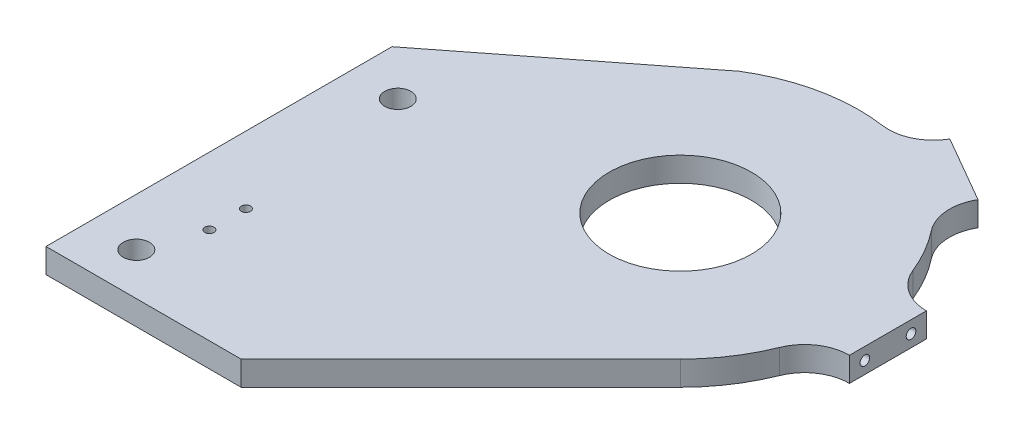
ISO-10303-21;
HEADER;
FILE_DESCRIPTION(('STEP AP214'),'2;1');
FILE_NAME('part.step','',(''),(''),'','','');
FILE_SCHEMA(('AUTOMOTIVE_DESIGN { 1 0 10303 214 1 1 1 1 }'));
ENDSEC;
DATA;
#1=APPLICATION_CONTEXT('core data for automotive mechanical design processes');
#2=APPLICATION_PROTOCOL_DEFINITION('international standard','automotive_design',2000,#1);
#3=PRODUCT_CONTEXT('',#1,'mechanical');
#4=PRODUCT('Part','Part','',(#3));
#5=PRODUCT_RELATED_PRODUCT_CATEGORY('part','',(#4));
#6=PRODUCT_DEFINITION_FORMATION('','',#4);
#7=PRODUCT_DEFINITION_CONTEXT('part definition',#1,'design');
#8=PRODUCT_DEFINITION('design','',#6,#7);
#9=PRODUCT_DEFINITION_SHAPE('','',#8);
#10=(LENGTH_UNIT() NAMED_UNIT(*) SI_UNIT(.MILLI.,.METRE.));
#11=(NAMED_UNIT(*) PLANE_ANGLE_UNIT() SI_UNIT($,.RADIAN.));
#12=(NAMED_UNIT(*) SI_UNIT($,.STERADIAN.) SOLID_ANGLE_UNIT());
#13=UNCERTAINTY_MEASURE_WITH_UNIT(LENGTH_MEASURE(1.E-05),#10,'distance_accuracy_value','');
#14=(GEOMETRIC_REPRESENTATION_CONTEXT(3) GLOBAL_UNCERTAINTY_ASSIGNED_CONTEXT((#13)) GLOBAL_UNIT_ASSIGNED_CONTEXT((#10,
#11,#12)) REPRESENTATION_CONTEXT('',''));
#15=CARTESIAN_POINT('',(0.,0.,0.));
#16=DIRECTION('',(0.,0.,1.));
#17=DIRECTION('',(1.,0.,0.));
#18=AXIS2_PLACEMENT_3D('',#15,#16,#17);
#19=CARTESIAN_POINT('',(75.,-6.35,-90.));
#20=DIRECTION('',(0.,1.,0.));
#21=DIRECTION('',(0.,0.,1.));
#22=AXIS2_PLACEMENT_3D('',#19,#20,#21);
#23=CYLINDRICAL_SURFACE('',#22,46.5);
#24=CARTESIAN_POINT('',(75.,0.,-90.));
#25=DIRECTION('',(0.,1.,0.));
#26=DIRECTION('',(0.,0.,-1.));
#27=AXIS2_PLACEMENT_3D('',#24,#25,#26);
#28=CIRCLE('',#27,46.5);
#29=CARTESIAN_POINT('',(81.5611958816388,0.,-136.034777164691));
#30=VERTEX_POINT('',#29);
#31=CARTESIAN_POINT('',(50.7609306503488,0.,-129.682710555893));
#32=VERTEX_POINT('',#31);
#33=EDGE_CURVE('E285',#30,#32,#28,.T.);
#34=ORIENTED_EDGE('',*,*,#33,.F.);
#35=DIRECTION('',(0.,-1.,0.));
#36=VECTOR('',#35,1.);
#37=CARTESIAN_POINT('',(81.5611958816388,37.8624128084729,-136.034777164691));
#38=LINE('',#37,#36);
#39=CARTESIAN_POINT('',(81.5611958816388,-6.35,-136.034777164691));
#40=VERTEX_POINT('',#39);
#41=EDGE_CURVE('E60',#30,#40,#38,.T.);
#42=ORIENTED_EDGE('',*,*,#41,.T.);
#43=CARTESIAN_POINT('',(75.,-6.35,-90.));
#44=DIRECTION('',(0.,1.,0.));
#45=DIRECTION('',(0.,0.,-1.));
#46=AXIS2_PLACEMENT_3D('',#43,#44,#45);
#47=CIRCLE('',#46,46.5);
#48=CARTESIAN_POINT('',(50.7609306503488,-6.35,-129.682710555893));
#49=VERTEX_POINT('',#48);
#50=EDGE_CURVE('E269',#40,#49,#47,.T.);
#51=ORIENTED_EDGE('',*,*,#50,.T.);
#52=DIRECTION('',(0.,1.,0.));
#53=VECTOR('',#52,1.);
#54=CARTESIAN_POINT('',(50.7609306503488,-6.35,-129.682710555893));
#55=LINE('',#54,#53);
#56=EDGE_CURVE('E52',#49,#32,#55,.T.);
#57=ORIENTED_EDGE('',*,*,#56,.T.);
#58=EDGE_LOOP('',(#34,#42,#51,#57));
#59=FACE_BOUND('',#58,.T.);
#60=ADVANCED_FACE('F43',(#59),#23,.T.);
#61=DIRECTION('',(0.,-1.,0.));
#62=VECTOR('',#61,1.);
#63=CARTESIAN_POINT('',(111.586688541359,37.8624128084729,-118.699550895051));
#64=LINE('',#63,#62);
#65=CARTESIAN_POINT('',(111.586688541359,0.,-118.699550895051));
#66=VERTEX_POINT('',#65);
#67=CARTESIAN_POINT('',(111.586688541359,-6.35,-118.699550895051));
#68=VERTEX_POINT('',#67);
#69=EDGE_CURVE('E176',#66,#68,#64,.T.);
#70=ORIENTED_EDGE('',*,*,#69,.F.);
#71=CARTESIAN_POINT('',(118.147884422998,0.,-107.33522626964));
#72=VERTEX_POINT('',#71);
#73=EDGE_CURVE('E289',#72,#66,#28,.T.);
#74=ORIENTED_EDGE('',*,*,#73,.F.);
#75=DIRECTION('',(0.,-1.,0.));
#76=VECTOR('',#75,1.);
#77=CARTESIAN_POINT('',(118.147884422998,36.3291713609758,-107.33522626964));
#78=LINE('',#77,#76);
#79=CARTESIAN_POINT('',(118.147884422998,-6.35,-107.33522626964));
#80=VERTEX_POINT('',#79);
#81=EDGE_CURVE('E68',#72,#80,#78,.T.);
#82=ORIENTED_EDGE('',*,*,#81,.T.);
#83=EDGE_CURVE('E274',#80,#68,#47,.T.);
#84=ORIENTED_EDGE('',*,*,#83,.T.);
#85=EDGE_LOOP('',(#70,#74,#82,#84));
#86=FACE_BOUND('',#85,.T.);
#87=ADVANCED_FACE('F337',(#86),#23,.T.);
#88=CARTESIAN_POINT('',(0.,-6.35,0.));
#89=DIRECTION('',(-1.,0.,0.));
#90=DIRECTION('',(0.,0.,1.));
#91=AXIS2_PLACEMENT_3D('',#88,#89,#90);
#92=PLANE('',#91);
#93=DIRECTION('',(0.,0.,1.));
#94=VECTOR('',#93,1.);
#95=CARTESIAN_POINT('',(0.,0.,0.));
#96=LINE('',#95,#94);
#97=CARTESIAN_POINT('',(0.,0.,-90.));
#98=VERTEX_POINT('',#97);
#99=CARTESIAN_POINT('',(0.,0.,0.));
#100=VERTEX_POINT('',#99);
#101=EDGE_CURVE('E250',#98,#100,#96,.T.);
#102=ORIENTED_EDGE('',*,*,#101,.F.);
#103=DIRECTION('',(0.,1.,0.));
#104=VECTOR('',#103,1.);
#105=CARTESIAN_POINT('',(0.,-6.35,-90.));
#106=LINE('',#105,#104);
#107=CARTESIAN_POINT('',(0.,-6.35,-90.));
#108=VERTEX_POINT('',#107);
#109=EDGE_CURVE('E11',#108,#98,#106,.T.);
#110=ORIENTED_EDGE('',*,*,#109,.F.);
#111=DIRECTION('',(0.,0.,1.));
#112=VECTOR('',#111,1.);
#113=CARTESIAN_POINT('',(0.,-6.35,0.));
#114=LINE('',#113,#112);
#115=CARTESIAN_POINT('',(0.,-6.35,0.));
#116=VERTEX_POINT('',#115);
#117=EDGE_CURVE('E259',#108,#116,#114,.T.);
#118=ORIENTED_EDGE('',*,*,#117,.T.);
#119=DIRECTION('',(0.,1.,0.));
#120=VECTOR('',#119,1.);
#121=CARTESIAN_POINT('',(0.,-6.35,0.));
#122=LINE('',#121,#120);
#123=EDGE_CURVE('E47',#116,#100,#122,.T.);
#124=ORIENTED_EDGE('',*,*,#123,.T.);
#125=EDGE_LOOP('',(#102,#110,#118,#124));
#126=FACE_BOUND('',#125,.T.);
#127=ADVANCED_FACE('F45',(#126),#92,.T.);
#128=CARTESIAN_POINT('',(0.,-6.35,-90.));
#129=DIRECTION('',(-0.615892028317826,0.,-0.787830571540959));
#130=DIRECTION('',(-0.787830571540959,0.,0.615892028317826));
#131=AXIS2_PLACEMENT_3D('',#128,#129,#130);
#132=PLANE('',#131);
#133=DIRECTION('',(-0.787830571540959,0.,0.615892028317826));
#134=VECTOR('',#133,1.);
#135=CARTESIAN_POINT('',(0.,0.,-90.));
#136=LINE('',#135,#134);
#137=EDGE_CURVE('E263',#32,#98,#136,.T.);
#138=ORIENTED_EDGE('',*,*,#137,.F.);
#139=ORIENTED_EDGE('',*,*,#56,.F.);
#140=DIRECTION('',(-0.787830571540959,0.,0.615892028317826));
#141=VECTOR('',#140,1.);
#142=CARTESIAN_POINT('',(0.,-6.35,-90.));
#143=LINE('',#142,#141);
#144=EDGE_CURVE('E273',#49,#108,#143,.T.);
#145=ORIENTED_EDGE('',*,*,#144,.T.);
#146=ORIENTED_EDGE('',*,*,#109,.T.);
#147=EDGE_LOOP('',(#138,#139,#145,#146));
#148=FACE_BOUND('',#147,.T.);
#149=ADVANCED_FACE('F310',(#148),#132,.T.);
#150=DIRECTION('',(0.,-1.,0.));
#151=VECTOR('',#150,1.);
#152=CARTESIAN_POINT('',(118.147884422998,36.3291713609758,-72.6647737303596));
#153=LINE('',#152,#151);
#154=CARTESIAN_POINT('',(118.147884422998,0.,-72.6647737303596));
#155=VERTEX_POINT('',#154);
#156=CARTESIAN_POINT('',(118.147884422998,-6.35,-72.6647737303596));
#157=VERTEX_POINT('',#156);
#158=EDGE_CURVE('E210',#155,#157,#153,.T.);
#159=ORIENTED_EDGE('',*,*,#158,.F.);
#160=CARTESIAN_POINT('',(107.880465325174,0.,-57.1195346748255));
#161=VERTEX_POINT('',#160);
#162=EDGE_CURVE('E286',#161,#155,#28,.T.);
#163=ORIENTED_EDGE('',*,*,#162,.F.);
#164=DIRECTION('',(0.,1.,0.));
#165=VECTOR('',#164,1.);
#166=CARTESIAN_POINT('',(107.880465325174,-6.35,-57.1195346748255));
#167=LINE('',#166,#165);
#168=CARTESIAN_POINT('',(107.880465325174,-6.35,-57.1195346748255));
#169=VERTEX_POINT('',#168);
#170=EDGE_CURVE('E294',#169,#161,#167,.T.);
#171=ORIENTED_EDGE('',*,*,#170,.F.);
#172=EDGE_CURVE('E270',#169,#157,#47,.T.);
#173=ORIENTED_EDGE('',*,*,#172,.T.);
#174=EDGE_LOOP('',(#159,#163,#171,#173));
#175=FACE_BOUND('',#174,.T.);
#176=ADVANCED_FACE('F323',(#175),#23,.T.);
#177=CARTESIAN_POINT('',(107.880465325174,-6.35,-57.1195346748255));
#178=DIRECTION('',(0.707106781186547,0.,0.707106781186548));
#179=DIRECTION('',(0.707106781186548,0.,-0.707106781186547));
#180=AXIS2_PLACEMENT_3D('',#177,#178,#179);
#181=PLANE('',#180);
#182=DIRECTION('',(0.707106781186548,0.,-0.707106781186547));
#183=VECTOR('',#182,1.);
#184=CARTESIAN_POINT('',(107.880465325174,0.,-57.1195346748255));
#185=LINE('',#184,#183);
#186=CARTESIAN_POINT('',(50.7609306503488,0.,0.));
#187=VERTEX_POINT('',#186);
#188=EDGE_CURVE('E282',#187,#161,#185,.T.);
#189=ORIENTED_EDGE('',*,*,#188,.F.);
#190=DIRECTION('',(0.,1.,0.));
#191=VECTOR('',#190,1.);
#192=CARTESIAN_POINT('',(50.7609306503488,-6.35,0.));
#193=LINE('',#192,#191);
#194=CARTESIAN_POINT('',(50.7609306503488,-6.35,0.));
#195=VERTEX_POINT('',#194);
#196=EDGE_CURVE('E295',#195,#187,#193,.T.);
#197=ORIENTED_EDGE('',*,*,#196,.F.);
#198=DIRECTION('',(0.707106781186548,0.,-0.707106781186547));
#199=VECTOR('',#198,1.);
#200=CARTESIAN_POINT('',(107.880465325174,-6.35,-57.1195346748255));
#201=LINE('',#200,#199);
#202=EDGE_CURVE('E266',#195,#169,#201,.T.);
#203=ORIENTED_EDGE('',*,*,#202,.T.);
#204=ORIENTED_EDGE('',*,*,#170,.T.);
#205=EDGE_LOOP('',(#189,#197,#203,#204));
#206=FACE_BOUND('',#205,.T.);
#207=ADVANCED_FACE('F318',(#206),#181,.T.);
#208=CARTESIAN_POINT('',(0.,-6.35,0.));
#209=DIRECTION('',(0.,0.,1.));
#210=DIRECTION('',(1.,0.,0.));
#211=AXIS2_PLACEMENT_3D('',#208,#209,#210);
#212=PLANE('',#211);
#213=DIRECTION('',(1.,0.,0.));
#214=VECTOR('',#213,1.);
#215=CARTESIAN_POINT('',(0.,0.,0.));
#216=LINE('',#215,#214);
#217=EDGE_CURVE('E279',#100,#187,#216,.T.);
#218=ORIENTED_EDGE('',*,*,#217,.F.);
#219=ORIENTED_EDGE('',*,*,#123,.F.);
#220=DIRECTION('',(1.,0.,0.));
#221=VECTOR('',#220,1.);
#222=CARTESIAN_POINT('',(0.,-6.35,0.));
#223=LINE('',#222,#221);
#224=EDGE_CURVE('E262',#116,#195,#223,.T.);
#225=ORIENTED_EDGE('',*,*,#224,.T.);
#226=ORIENTED_EDGE('',*,*,#196,.T.);
#227=EDGE_LOOP('',(#218,#219,#225,#226));
#228=FACE_BOUND('',#227,.T.);
#229=ADVANCED_FACE('F303',(#228),#212,.T.);
#230=CARTESIAN_POINT('',(75.,-6.35,-90.));
#231=DIRECTION('',(0.,-1.,0.));
#232=DIRECTION('',(0.,0.,-1.));
#233=AXIS2_PLACEMENT_3D('',#230,#231,#232);
#234=PLANE('',#233);
#235=CARTESIAN_POINT('',(17.5,-6.35,-25.));
#236=DIRECTION('',(0.,1.,0.));
#237=DIRECTION('',(0.,0.,1.));
#238=AXIS2_PLACEMENT_3D('',#235,#236,#237);
#239=CIRCLE('',#238,1.2);
#240=CARTESIAN_POINT('',(17.5,-6.35,-23.8));
#241=VERTEX_POINT('',#240);
#242=EDGE_CURVE('E229',#241,#241,#239,.T.);
#243=ORIENTED_EDGE('',*,*,#242,.T.);
#244=EDGE_LOOP('',(#243));
#245=FACE_BOUND('',#244,.T.);
#246=CARTESIAN_POINT('',(17.5,-6.35,-34.5));
#247=DIRECTION('',(0.,1.,0.));
#248=DIRECTION('',(0.,0.,1.));
#249=AXIS2_PLACEMENT_3D('',#246,#247,#248);
#250=CIRCLE('',#249,1.2);
#251=CARTESIAN_POINT('',(17.5,-6.35,-33.3));
#252=VERTEX_POINT('',#251);
#253=EDGE_CURVE('E228',#252,#252,#250,.T.);
#254=ORIENTED_EDGE('',*,*,#253,.T.);
#255=EDGE_LOOP('',(#254));
#256=FACE_BOUND('',#255,.T.);
#257=CARTESIAN_POINT('',(75.,-6.35,-90.));
#258=DIRECTION('',(0.,1.,0.));
#259=DIRECTION('',(0.,0.,1.));
#260=AXIS2_PLACEMENT_3D('',#257,#258,#259);
#261=CIRCLE('',#260,18.5);
#262=CARTESIAN_POINT('',(75.,-6.35,-71.5));
#263=VERTEX_POINT('',#262);
#264=EDGE_CURVE('E241',#263,#263,#261,.T.);
#265=ORIENTED_EDGE('',*,*,#264,.T.);
#266=EDGE_LOOP('',(#265));
#267=FACE_BOUND('',#266,.T.);
#268=CARTESIAN_POINT('',(12.5,-6.35,-79.));
#269=DIRECTION('',(0.,1.,0.));
#270=DIRECTION('',(0.,0.,1.));
#271=AXIS2_PLACEMENT_3D('',#268,#269,#270);
#272=CIRCLE('',#271,3.4);
#273=CARTESIAN_POINT('',(12.5,-6.35,-75.6));
#274=VERTEX_POINT('',#273);
#275=EDGE_CURVE('E247',#274,#274,#272,.T.);
#276=ORIENTED_EDGE('',*,*,#275,.T.);
#277=EDGE_LOOP('',(#276));
#278=FACE_BOUND('',#277,.T.);
#279=CARTESIAN_POINT('',(12.5,-6.35,-11.));
#280=DIRECTION('',(0.,1.,0.));
#281=DIRECTION('',(0.,0.,-1.));
#282=AXIS2_PLACEMENT_3D('',#279,#280,#281);
#283=CIRCLE('',#282,3.4);
#284=CARTESIAN_POINT('',(12.5,-6.35,-14.4));
#285=VERTEX_POINT('',#284);
#286=EDGE_CURVE('E244',#285,#285,#283,.T.);
#287=ORIENTED_EDGE('',*,*,#286,.T.);
#288=EDGE_LOOP('',(#287));
#289=FACE_BOUND('',#288,.T.);
#290=ORIENTED_EDGE('',*,*,#117,.F.);
#291=ORIENTED_EDGE('',*,*,#144,.F.);
#292=ORIENTED_EDGE('',*,*,#50,.F.);
#293=CARTESIAN_POINT('',(83.211400914471,-6.35,-147.612974544086));
#294=DIRECTION('',(0.,1.,0.));
#295=DIRECTION('',(-0.86602540378444,0.,-0.499999999999998));
#296=AXIS2_PLACEMENT_3D('',#293,#294,#295);
#297=CIRCLE('',#296,11.695205479452);
#298=CARTESIAN_POINT('',(93.3397459621554,-6.35,-141.76537180436));
#299=VERTEX_POINT('',#298);
#300=EDGE_CURVE('E172',#40,#299,#297,.T.);
#301=ORIENTED_EDGE('',*,*,#300,.T.);
#302=DIRECTION('',(0.86602540378444,0.,0.499999999999998));
#303=VECTOR('',#302,1.);
#304=CARTESIAN_POINT('',(93.3397459621554,-6.35,-141.76537180436));
#305=LINE('',#304,#303);
#306=CARTESIAN_POINT('',(110.660254037844,-6.35,-131.76537180436));
#307=VERTEX_POINT('',#306);
#308=EDGE_CURVE('E181',#299,#307,#305,.T.);
#309=ORIENTED_EDGE('',*,*,#308,.T.);
#310=CARTESIAN_POINT('',(120.788599085529,-6.35,-125.917769064634));
#311=DIRECTION('',(0.,1.,0.));
#312=DIRECTION('',(0.86602540378444,0.,0.499999999999998));
#313=AXIS2_PLACEMENT_3D('',#310,#311,#312);
#314=CIRCLE('',#313,11.695205479452);
#315=EDGE_CURVE('E184',#307,#68,#314,.T.);
#316=ORIENTED_EDGE('',*,*,#315,.T.);
#317=ORIENTED_EDGE('',*,*,#83,.F.);
#318=CARTESIAN_POINT('',(129.,-6.35,-111.695205479452));
#319=DIRECTION('',(0.,1.,0.));
#320=DIRECTION('',(0.,0.,-1.));
#321=AXIS2_PLACEMENT_3D('',#318,#319,#320);
#322=CIRCLE('',#321,11.695205479452);
#323=CARTESIAN_POINT('',(129.,-6.35,-100.));
#324=VERTEX_POINT('',#323);
#325=EDGE_CURVE('E206',#80,#324,#322,.T.);
#326=ORIENTED_EDGE('',*,*,#325,.T.);
#327=DIRECTION('',(0.,0.,1.));
#328=VECTOR('',#327,1.);
#329=CARTESIAN_POINT('',(129.,-6.35,-100.));
#330=LINE('',#329,#328);
#331=CARTESIAN_POINT('',(129.,-6.35,-80.));
#332=VERTEX_POINT('',#331);
#333=EDGE_CURVE('E215',#324,#332,#330,.T.);
#334=ORIENTED_EDGE('',*,*,#333,.T.);
#335=CARTESIAN_POINT('',(129.,-6.35,-68.304794520548));
#336=DIRECTION('',(0.,1.,0.));
#337=DIRECTION('',(0.,0.,1.));
#338=AXIS2_PLACEMENT_3D('',#335,#336,#337);
#339=CIRCLE('',#338,11.695205479452);
#340=EDGE_CURVE('E218',#332,#157,#339,.T.);
#341=ORIENTED_EDGE('',*,*,#340,.T.);
#342=ORIENTED_EDGE('',*,*,#172,.F.);
#343=ORIENTED_EDGE('',*,*,#202,.F.);
#344=ORIENTED_EDGE('',*,*,#224,.F.);
#345=EDGE_LOOP('',(#290,#291,#292,#301,#309,#316,#317,#326,#334,#341,#342,#343,#344));
#346=FACE_BOUND('',#345,.T.);
#347=ADVANCED_FACE('F313',(#245,#256,#267,#278,#289,#346),#234,.T.);
#348=CARTESIAN_POINT('',(75.,0.,-90.));
#349=DIRECTION('',(0.,-1.,0.));
#350=DIRECTION('',(0.,0.,-1.));
#351=AXIS2_PLACEMENT_3D('',#348,#349,#350);
#352=PLANE('',#351);
#353=CARTESIAN_POINT('',(17.5,0.,-25.));
#354=DIRECTION('',(0.,1.,0.));
#355=DIRECTION('',(0.,0.,1.));
#356=AXIS2_PLACEMENT_3D('',#353,#354,#355);
#357=CIRCLE('',#356,1.2);
#358=CARTESIAN_POINT('',(17.5,0.,-23.8));
#359=VERTEX_POINT('',#358);
#360=EDGE_CURVE('E233',#359,#359,#357,.T.);
#361=ORIENTED_EDGE('',*,*,#360,.F.);
#362=EDGE_LOOP('',(#361));
#363=FACE_BOUND('',#362,.T.);
#364=CARTESIAN_POINT('',(17.5,0.,-34.5));
#365=DIRECTION('',(0.,1.,0.));
#366=DIRECTION('',(0.,0.,1.));
#367=AXIS2_PLACEMENT_3D('',#364,#365,#366);
#368=CIRCLE('',#367,1.2);
#369=CARTESIAN_POINT('',(17.5,0.,-33.3));
#370=VERTEX_POINT('',#369);
#371=EDGE_CURVE('E236',#370,#370,#368,.T.);
#372=ORIENTED_EDGE('',*,*,#371,.F.);
#373=EDGE_LOOP('',(#372));
#374=FACE_BOUND('',#373,.T.);
#375=CARTESIAN_POINT('',(75.,0.,-90.));
#376=DIRECTION('',(0.,1.,0.));
#377=DIRECTION('',(0.,0.,1.));
#378=AXIS2_PLACEMENT_3D('',#375,#376,#377);
#379=CIRCLE('',#378,18.5);
#380=CARTESIAN_POINT('',(75.,0.,-71.5));
#381=VERTEX_POINT('',#380);
#382=EDGE_CURVE('E232',#381,#381,#379,.T.);
#383=ORIENTED_EDGE('',*,*,#382,.F.);
#384=EDGE_LOOP('',(#383));
#385=FACE_BOUND('',#384,.T.);
#386=CARTESIAN_POINT('',(12.5,0.,-79.));
#387=DIRECTION('',(0.,1.,0.));
#388=DIRECTION('',(0.,0.,1.));
#389=AXIS2_PLACEMENT_3D('',#386,#387,#388);
#390=CIRCLE('',#389,3.4);
#391=CARTESIAN_POINT('',(12.5,0.,-75.6));
#392=VERTEX_POINT('',#391);
#393=EDGE_CURVE('E251',#392,#392,#390,.T.);
#394=ORIENTED_EDGE('',*,*,#393,.F.);
#395=EDGE_LOOP('',(#394));
#396=FACE_BOUND('',#395,.T.);
#397=CARTESIAN_POINT('',(12.5,0.,-11.));
#398=DIRECTION('',(0.,1.,0.));
#399=DIRECTION('',(0.,0.,-1.));
#400=AXIS2_PLACEMENT_3D('',#397,#398,#399);
#401=CIRCLE('',#400,3.4);
#402=CARTESIAN_POINT('',(12.5,0.,-14.4));
#403=VERTEX_POINT('',#402);
#404=EDGE_CURVE('E254',#403,#403,#401,.T.);
#405=ORIENTED_EDGE('',*,*,#404,.F.);
#406=EDGE_LOOP('',(#405));
#407=FACE_BOUND('',#406,.T.);
#408=ORIENTED_EDGE('',*,*,#101,.T.);
#409=ORIENTED_EDGE('',*,*,#217,.T.);
#410=ORIENTED_EDGE('',*,*,#188,.T.);
#411=ORIENTED_EDGE('',*,*,#162,.T.);
#412=CARTESIAN_POINT('',(129.,0.,-68.304794520548));
#413=DIRECTION('',(0.,-1.,0.));
#414=DIRECTION('',(0.,0.,-1.));
#415=AXIS2_PLACEMENT_3D('',#412,#413,#414);
#416=CIRCLE('',#415,11.695205479452);
#417=CARTESIAN_POINT('',(129.,0.,-80.));
#418=VERTEX_POINT('',#417);
#419=EDGE_CURVE('E209',#155,#418,#416,.T.);
#420=ORIENTED_EDGE('',*,*,#419,.T.);
#421=DIRECTION('',(0.,0.,-1.));
#422=VECTOR('',#421,1.);
#423=CARTESIAN_POINT('',(129.,0.,-100.));
#424=LINE('',#423,#422);
#425=CARTESIAN_POINT('',(129.,0.,-100.));
#426=VERTEX_POINT('',#425);
#427=EDGE_CURVE('E207',#418,#426,#424,.T.);
#428=ORIENTED_EDGE('',*,*,#427,.T.);
#429=CARTESIAN_POINT('',(129.,0.,-111.695205479452));
#430=DIRECTION('',(0.,-1.,0.));
#431=DIRECTION('',(0.,0.,-1.));
#432=AXIS2_PLACEMENT_3D('',#429,#430,#431);
#433=CIRCLE('',#432,11.695205479452);
#434=EDGE_CURVE('E212',#426,#72,#433,.T.);
#435=ORIENTED_EDGE('',*,*,#434,.T.);
#436=ORIENTED_EDGE('',*,*,#73,.T.);
#437=CARTESIAN_POINT('',(120.788599085529,0.,-125.917769064634));
#438=DIRECTION('',(0.,-1.,0.));
#439=DIRECTION('',(0.,0.,-1.));
#440=AXIS2_PLACEMENT_3D('',#437,#438,#439);
#441=CIRCLE('',#440,11.695205479452);
#442=CARTESIAN_POINT('',(110.660254037844,0.,-131.76537180436));
#443=VERTEX_POINT('',#442);
#444=EDGE_CURVE('E175',#66,#443,#441,.T.);
#445=ORIENTED_EDGE('',*,*,#444,.T.);
#446=DIRECTION('',(-0.86602540378444,0.,-0.499999999999998));
#447=VECTOR('',#446,1.);
#448=CARTESIAN_POINT('',(93.3397459621554,0.,-141.76537180436));
#449=LINE('',#448,#447);
#450=CARTESIAN_POINT('',(93.3397459621554,0.,-141.76537180436));
#451=VERTEX_POINT('',#450);
#452=EDGE_CURVE('E173',#443,#451,#449,.T.);
#453=ORIENTED_EDGE('',*,*,#452,.T.);
#454=CARTESIAN_POINT('',(83.211400914471,0.,-147.612974544086));
#455=DIRECTION('',(0.,-1.,0.));
#456=DIRECTION('',(0.,0.,-1.));
#457=AXIS2_PLACEMENT_3D('',#454,#455,#456);
#458=CIRCLE('',#457,11.695205479452);
#459=EDGE_CURVE('E178',#451,#30,#458,.T.);
#460=ORIENTED_EDGE('',*,*,#459,.T.);
#461=ORIENTED_EDGE('',*,*,#33,.T.);
#462=ORIENTED_EDGE('',*,*,#137,.T.);
#463=EDGE_LOOP('',(#408,#409,#410,#411,#420,#428,#435,#436,#445,#453,#460,#461,#462));
#464=FACE_BOUND('',#463,.T.);
#465=ADVANCED_FACE('F305',(#363,#374,#385,#396,#407,#464),#352,.F.);
#466=CARTESIAN_POINT('',(12.5,-6.35,-11.));
#467=DIRECTION('',(0.,1.,0.));
#468=DIRECTION('',(0.,0.,1.));
#469=AXIS2_PLACEMENT_3D('',#466,#467,#468);
#470=CYLINDRICAL_SURFACE('',#469,3.4);
#471=ORIENTED_EDGE('',*,*,#286,.F.);
#472=EDGE_LOOP('',(#471));
#473=FACE_BOUND('',#472,.T.);
#474=ORIENTED_EDGE('',*,*,#404,.T.);
#475=EDGE_LOOP('',(#474));
#476=FACE_BOUND('',#475,.T.);
#477=ADVANCED_FACE('F370',(#473,#476),#470,.F.);
#478=CARTESIAN_POINT('',(12.5,-6.35,-79.));
#479=DIRECTION('',(0.,1.,0.));
#480=DIRECTION('',(0.,0.,1.));
#481=AXIS2_PLACEMENT_3D('',#478,#479,#480);
#482=CYLINDRICAL_SURFACE('',#481,3.4);
#483=ORIENTED_EDGE('',*,*,#275,.F.);
#484=EDGE_LOOP('',(#483));
#485=FACE_BOUND('',#484,.T.);
#486=ORIENTED_EDGE('',*,*,#393,.T.);
#487=EDGE_LOOP('',(#486));
#488=FACE_BOUND('',#487,.T.);
#489=ADVANCED_FACE('F377',(#485,#488),#482,.F.);
#490=CARTESIAN_POINT('',(75.,-6.35,-90.));
#491=DIRECTION('',(0.,1.,0.));
#492=DIRECTION('',(0.,0.,1.));
#493=AXIS2_PLACEMENT_3D('',#490,#491,#492);
#494=CYLINDRICAL_SURFACE('',#493,18.5);
#495=ORIENTED_EDGE('',*,*,#264,.F.);
#496=EDGE_LOOP('',(#495));
#497=FACE_BOUND('',#496,.T.);
#498=ORIENTED_EDGE('',*,*,#382,.T.);
#499=EDGE_LOOP('',(#498));
#500=FACE_BOUND('',#499,.T.);
#501=ADVANCED_FACE('F381',(#497,#500),#494,.F.);
#502=CARTESIAN_POINT('',(17.5,-6.35,-34.5));
#503=DIRECTION('',(0.,1.,0.));
#504=DIRECTION('',(0.,0.,1.));
#505=AXIS2_PLACEMENT_3D('',#502,#503,#504);
#506=CYLINDRICAL_SURFACE('',#505,1.2);
#507=ORIENTED_EDGE('',*,*,#253,.F.);
#508=EDGE_LOOP('',(#507));
#509=FACE_BOUND('',#508,.T.);
#510=ORIENTED_EDGE('',*,*,#371,.T.);
#511=EDGE_LOOP('',(#510));
#512=FACE_BOUND('',#511,.T.);
#513=ADVANCED_FACE('F385',(#509,#512),#506,.F.);
#514=CARTESIAN_POINT('',(17.5,-6.35,-25.));
#515=DIRECTION('',(0.,1.,0.));
#516=DIRECTION('',(0.,0.,1.));
#517=AXIS2_PLACEMENT_3D('',#514,#515,#516);
#518=CYLINDRICAL_SURFACE('',#517,1.2);
#519=ORIENTED_EDGE('',*,*,#242,.F.);
#520=EDGE_LOOP('',(#519));
#521=FACE_BOUND('',#520,.T.);
#522=ORIENTED_EDGE('',*,*,#360,.T.);
#523=EDGE_LOOP('',(#522));
#524=FACE_BOUND('',#523,.T.);
#525=ADVANCED_FACE('F389',(#521,#524),#518,.F.);
#526=CARTESIAN_POINT('',(129.,36.3291713609758,-68.304794520548));
#527=DIRECTION('',(0.,-1.,0.));
#528=DIRECTION('',(0.,0.,-1.));
#529=AXIS2_PLACEMENT_3D('',#526,#527,#528);
#530=CYLINDRICAL_SURFACE('',#529,11.695205479452);
#531=ORIENTED_EDGE('',*,*,#419,.F.);
#532=ORIENTED_EDGE('',*,*,#158,.T.);
#533=ORIENTED_EDGE('',*,*,#340,.F.);
#534=DIRECTION('',(0.,-1.,0.));
#535=VECTOR('',#534,1.);
#536=CARTESIAN_POINT('',(129.,36.3291713609758,-80.));
#537=LINE('',#536,#535);
#538=EDGE_CURVE('E222',#418,#332,#537,.T.);
#539=ORIENTED_EDGE('',*,*,#538,.F.);
#540=EDGE_LOOP('',(#531,#532,#533,#539));
#541=FACE_BOUND('',#540,.T.);
#542=ADVANCED_FACE('F326',(#541),#530,.F.);
#543=CARTESIAN_POINT('',(129.,36.3291713609758,-100.));
#544=DIRECTION('',(1.,0.,0.));
#545=DIRECTION('',(0.,0.,-1.));
#546=AXIS2_PLACEMENT_3D('',#543,#544,#545);
#547=PLANE('',#546);
#548=CARTESIAN_POINT('',(129.,-3.175,-96.));
#549=DIRECTION('',(1.,0.,0.));
#550=DIRECTION('',(0.,0.,-1.));
#551=AXIS2_PLACEMENT_3D('',#548,#549,#550);
#552=CIRCLE('',#551,1.24999999999999);
#553=CARTESIAN_POINT('',(129.,-3.175,-97.25));
#554=VERTEX_POINT('',#553);
#555=EDGE_CURVE('E194',#554,#554,#552,.T.);
#556=ORIENTED_EDGE('',*,*,#555,.F.);
#557=EDGE_LOOP('',(#556));
#558=FACE_BOUND('',#557,.T.);
#559=CARTESIAN_POINT('',(129.,-3.17499999999997,-84.));
#560=DIRECTION('',(1.,0.,0.));
#561=DIRECTION('',(0.,0.,-1.));
#562=AXIS2_PLACEMENT_3D('',#559,#560,#561);
#563=CIRCLE('',#562,1.24999999999999);
#564=CARTESIAN_POINT('',(129.,-3.17499999999997,-85.25));
#565=VERTEX_POINT('',#564);
#566=EDGE_CURVE('E200',#565,#565,#563,.T.);
#567=ORIENTED_EDGE('',*,*,#566,.F.);
#568=EDGE_LOOP('',(#567));
#569=FACE_BOUND('',#568,.T.);
#570=ORIENTED_EDGE('',*,*,#427,.F.);
#571=ORIENTED_EDGE('',*,*,#538,.T.);
#572=ORIENTED_EDGE('',*,*,#333,.F.);
#573=DIRECTION('',(0.,-1.,0.));
#574=VECTOR('',#573,1.);
#575=CARTESIAN_POINT('',(129.,36.3291713609758,-100.));
#576=LINE('',#575,#574);
#577=EDGE_CURVE('E224',#426,#324,#576,.T.);
#578=ORIENTED_EDGE('',*,*,#577,.F.);
#579=EDGE_LOOP('',(#570,#571,#572,#578));
#580=FACE_BOUND('',#579,.T.);
#581=ADVANCED_FACE('F332',(#558,#569,#580),#547,.T.);
#582=CARTESIAN_POINT('',(129.,36.3291713609758,-111.695205479452));
#583=DIRECTION('',(0.,-1.,0.));
#584=DIRECTION('',(0.,0.,-1.));
#585=AXIS2_PLACEMENT_3D('',#582,#583,#584);
#586=CYLINDRICAL_SURFACE('',#585,11.695205479452);
#587=ORIENTED_EDGE('',*,*,#434,.F.);
#588=ORIENTED_EDGE('',*,*,#577,.T.);
#589=ORIENTED_EDGE('',*,*,#325,.F.);
#590=ORIENTED_EDGE('',*,*,#81,.F.);
#591=EDGE_LOOP('',(#587,#588,#589,#590));
#592=FACE_BOUND('',#591,.T.);
#593=ADVANCED_FACE('F393',(#592),#586,.F.);
#594=CARTESIAN_POINT('',(124.,-3.17499999999997,-84.));
#595=DIRECTION('',(1.,0.,0.));
#596=DIRECTION('',(0.,0.,-1.));
#597=AXIS2_PLACEMENT_3D('',#594,#595,#596);
#598=CONICAL_SURFACE('',#597,1.24999999999999,1.02974425867665);
#599=CARTESIAN_POINT('',(123.248924226216,-3.17499999999998,-84.));
#600=VERTEX_POINT('',#599);
#601=VERTEX_LOOP('',#600);
#602=FACE_BOUND('',#601,.T.);
#603=CARTESIAN_POINT('',(124.,-3.17499999999997,-84.));
#604=DIRECTION('',(1.,0.,0.));
#605=DIRECTION('',(0.,0.,-1.));
#606=AXIS2_PLACEMENT_3D('',#603,#604,#605);
#607=CIRCLE('',#606,1.24999999999999);
#608=CARTESIAN_POINT('',(124.,-3.17499999999997,-85.25));
#609=VERTEX_POINT('',#608);
#610=EDGE_CURVE('E203',#609,#609,#607,.T.);
#611=ORIENTED_EDGE('',*,*,#610,.T.);
#612=EDGE_LOOP('',(#611));
#613=FACE_BOUND('',#612,.T.);
#614=ADVANCED_FACE('F396',(#602,#613),#598,.F.);
#615=CARTESIAN_POINT('',(129.,-3.17499999999997,-84.));
#616=DIRECTION('',(1.,0.,0.));
#617=DIRECTION('',(0.,0.,-1.));
#618=AXIS2_PLACEMENT_3D('',#615,#616,#617);
#619=CYLINDRICAL_SURFACE('',#618,1.24999999999999);
#620=ORIENTED_EDGE('',*,*,#610,.F.);
#621=EDGE_LOOP('',(#620));
#622=FACE_BOUND('',#621,.T.);
#623=ORIENTED_EDGE('',*,*,#566,.T.);
#624=EDGE_LOOP('',(#623));
#625=FACE_BOUND('',#624,.T.);
#626=ADVANCED_FACE('F403',(#622,#625),#619,.F.);
#627=CARTESIAN_POINT('',(124.,-3.175,-96.));
#628=DIRECTION('',(1.,0.,0.));
#629=DIRECTION('',(0.,0.,-1.));
#630=AXIS2_PLACEMENT_3D('',#627,#628,#629);
#631=CONICAL_SURFACE('',#630,1.24999999999999,1.02974425867665);
#632=CARTESIAN_POINT('',(123.248924226216,-3.175,-96.));
#633=VERTEX_POINT('',#632);
#634=VERTEX_LOOP('',#633);
#635=FACE_BOUND('',#634,.T.);
#636=CARTESIAN_POINT('',(124.,-3.175,-96.));
#637=DIRECTION('',(1.,0.,0.));
#638=DIRECTION('',(0.,0.,-1.));
#639=AXIS2_PLACEMENT_3D('',#636,#637,#638);
#640=CIRCLE('',#639,1.24999999999999);
#641=CARTESIAN_POINT('',(124.,-3.175,-97.25));
#642=VERTEX_POINT('',#641);
#643=EDGE_CURVE('E197',#642,#642,#640,.T.);
#644=ORIENTED_EDGE('',*,*,#643,.T.);
#645=EDGE_LOOP('',(#644));
#646=FACE_BOUND('',#645,.T.);
#647=ADVANCED_FACE('F407',(#635,#646),#631,.F.);
#648=CARTESIAN_POINT('',(129.,-3.175,-96.));
#649=DIRECTION('',(1.,0.,0.));
#650=DIRECTION('',(0.,0.,-1.));
#651=AXIS2_PLACEMENT_3D('',#648,#649,#650);
#652=CYLINDRICAL_SURFACE('',#651,1.24999999999999);
#653=ORIENTED_EDGE('',*,*,#643,.F.);
#654=EDGE_LOOP('',(#653));
#655=FACE_BOUND('',#654,.T.);
#656=ORIENTED_EDGE('',*,*,#555,.T.);
#657=EDGE_LOOP('',(#656));
#658=FACE_BOUND('',#657,.T.);
#659=ADVANCED_FACE('F411',(#655,#658),#652,.F.);
#660=CARTESIAN_POINT('',(120.788599085529,37.8624128084729,-125.917769064634));
#661=DIRECTION('',(0.,-1.,0.));
#662=DIRECTION('',(0.,0.,-1.));
#663=AXIS2_PLACEMENT_3D('',#660,#661,#662);
#664=CYLINDRICAL_SURFACE('',#663,11.695205479452);
#665=ORIENTED_EDGE('',*,*,#444,.F.);
#666=ORIENTED_EDGE('',*,*,#69,.T.);
#667=ORIENTED_EDGE('',*,*,#315,.F.);
#668=DIRECTION('',(0.,-1.,0.));
#669=VECTOR('',#668,1.);
#670=CARTESIAN_POINT('',(110.660254037844,37.8624128084729,-131.76537180436));
#671=LINE('',#670,#669);
#672=EDGE_CURVE('E188',#443,#307,#671,.T.);
#673=ORIENTED_EDGE('',*,*,#672,.F.);
#674=EDGE_LOOP('',(#665,#666,#667,#673));
#675=FACE_BOUND('',#674,.T.);
#676=ADVANCED_FACE('F341',(#675),#664,.F.);
#677=CARTESIAN_POINT('',(93.3397459621554,37.8624128084729,-141.76537180436));
#678=DIRECTION('',(0.499999999999998,0.,-0.86602540378444));
#679=DIRECTION('',(-0.86602540378444,0.,-0.499999999999998));
#680=AXIS2_PLACEMENT_3D('',#677,#678,#679);
#681=PLANE('',#680);
#682=CARTESIAN_POINT('',(96.8038475772932,-3.175,-139.76537180436));
#683=DIRECTION('',(0.499999999999998,0.,-0.86602540378444));
#684=DIRECTION('',(-0.86602540378444,0.,-0.499999999999998));
#685=AXIS2_PLACEMENT_3D('',#682,#683,#684);
#686=CIRCLE('',#685,1.24999999999999);
#687=CARTESIAN_POINT('',(95.7213158225627,-3.175,-140.39037180436));
#688=VERTEX_POINT('',#687);
#689=EDGE_CURVE('E162',#688,#688,#686,.T.);
#690=ORIENTED_EDGE('',*,*,#689,.F.);
#691=EDGE_LOOP('',(#690));
#692=FACE_BOUND('',#691,.T.);
#693=CARTESIAN_POINT('',(107.196152422706,-3.17499999999997,-133.76537180436));
#694=DIRECTION('',(0.499999999999998,0.,-0.86602540378444));
#695=DIRECTION('',(-0.86602540378444,0.,-0.499999999999998));
#696=AXIS2_PLACEMENT_3D('',#693,#694,#695);
#697=CIRCLE('',#696,1.24999999999999);
#698=CARTESIAN_POINT('',(106.113620667976,-3.17499999999997,-134.39037180436));
#699=VERTEX_POINT('',#698);
#700=EDGE_CURVE('E161',#699,#699,#697,.T.);
#701=ORIENTED_EDGE('',*,*,#700,.F.);
#702=EDGE_LOOP('',(#701));
#703=FACE_BOUND('',#702,.T.);
#704=ORIENTED_EDGE('',*,*,#452,.F.);
#705=ORIENTED_EDGE('',*,*,#672,.T.);
#706=ORIENTED_EDGE('',*,*,#308,.F.);
#707=DIRECTION('',(0.,-1.,0.));
#708=VECTOR('',#707,1.);
#709=CARTESIAN_POINT('',(93.3397459621554,37.8624128084729,-141.76537180436));
#710=LINE('',#709,#708);
#711=EDGE_CURVE('E190',#451,#299,#710,.T.);
#712=ORIENTED_EDGE('',*,*,#711,.F.);
#713=EDGE_LOOP('',(#704,#705,#706,#712));
#714=FACE_BOUND('',#713,.T.);
#715=ADVANCED_FACE('F347',(#692,#703,#714),#681,.T.);
#716=CARTESIAN_POINT('',(83.211400914471,37.8624128084729,-147.612974544086));
#717=DIRECTION('',(0.,-1.,0.));
#718=DIRECTION('',(0.,0.,-1.));
#719=AXIS2_PLACEMENT_3D('',#716,#717,#718);
#720=CYLINDRICAL_SURFACE('',#719,11.695205479452);
#721=ORIENTED_EDGE('',*,*,#459,.F.);
#722=ORIENTED_EDGE('',*,*,#711,.T.);
#723=ORIENTED_EDGE('',*,*,#300,.F.);
#724=ORIENTED_EDGE('',*,*,#41,.F.);
#725=EDGE_LOOP('',(#721,#722,#723,#724));
#726=FACE_BOUND('',#725,.T.);
#727=ADVANCED_FACE('F415',(#726),#720,.F.);
#728=CARTESIAN_POINT('',(104.696152422706,-3.17499999999997,-129.435244785438));
#729=DIRECTION('',(0.499999999999998,0.,-0.86602540378444));
#730=DIRECTION('',(-0.86602540378444,0.,-0.499999999999998));
#731=AXIS2_PLACEMENT_3D('',#728,#729,#730);
#732=CONICAL_SURFACE('',#731,1.24999999999999,1.02974425867666);
#733=CARTESIAN_POINT('',(104.320614535814,-3.17499999999998,-128.784794085173));
#734=VERTEX_POINT('',#733);
#735=VERTEX_LOOP('',#734);
#736=FACE_BOUND('',#735,.T.);
#737=CARTESIAN_POINT('',(104.696152422706,-3.17499999999997,-129.435244785438));
#738=DIRECTION('',(0.499999999999998,0.,-0.86602540378444));
#739=DIRECTION('',(-0.86602540378444,0.,-0.499999999999998));
#740=AXIS2_PLACEMENT_3D('',#737,#738,#739);
#741=CIRCLE('',#740,1.24999999999999);
#742=CARTESIAN_POINT('',(103.613620667976,-3.17499999999997,-130.060244785438));
#743=VERTEX_POINT('',#742);
#744=EDGE_CURVE('E165',#743,#743,#741,.T.);
#745=ORIENTED_EDGE('',*,*,#744,.T.);
#746=EDGE_LOOP('',(#745));
#747=FACE_BOUND('',#746,.T.);
#748=ADVANCED_FACE('F418',(#736,#747),#732,.F.);
#749=CARTESIAN_POINT('',(107.196152422706,-3.17499999999997,-133.76537180436));
#750=DIRECTION('',(0.499999999999998,0.,-0.86602540378444));
#751=DIRECTION('',(-0.86602540378444,0.,-0.499999999999998));
#752=AXIS2_PLACEMENT_3D('',#749,#750,#751);
#753=CYLINDRICAL_SURFACE('',#752,1.24999999999999);
#754=CARTESIAN_POINT('',(103.613620667976,-3.17499999999997,-130.060244785438));
#755=CARTESIAN_POINT('',(103.639662334643,-3.17499999999997,-130.105350275218));
#756=CARTESIAN_POINT('',(103.665704001309,-3.17499999999997,-130.150455764998));
#757=CARTESIAN_POINT('',(103.717787334643,-3.17499999999997,-130.240666744559));
#758=CARTESIAN_POINT('',(103.743829001309,-3.17499999999997,-130.28577223434));
#759=CARTESIAN_POINT('',(103.795912334643,-3.17499999999997,-130.375983213901));
#760=CARTESIAN_POINT('',(103.821954001309,-3.17499999999997,-130.421088703681));
#761=CARTESIAN_POINT('',(103.874037334643,-3.17499999999997,-130.511299683242));
#762=CARTESIAN_POINT('',(103.900079001309,-3.17499999999997,-130.556405173022));
#763=CARTESIAN_POINT('',(103.952162334643,-3.17499999999997,-130.646616152583));
#764=CARTESIAN_POINT('',(103.978204001309,-3.17499999999997,-130.691721642364));
#765=CARTESIAN_POINT('',(104.030287334643,-3.17499999999997,-130.781932621925));
#766=CARTESIAN_POINT('',(104.056329001309,-3.17499999999997,-130.827038111705));
#767=CARTESIAN_POINT('',(104.108412334643,-3.17499999999997,-130.917249091266));
#768=CARTESIAN_POINT('',(104.134454001309,-3.17499999999997,-130.962354581046));
#769=CARTESIAN_POINT('',(104.186537334643,-3.17499999999997,-131.052565560607));
#770=CARTESIAN_POINT('',(104.212579001309,-3.17499999999997,-131.097671050388));
#771=CARTESIAN_POINT('',(104.264662334643,-3.17499999999997,-131.187882029949));
#772=CARTESIAN_POINT('',(104.290704001309,-3.17499999999997,-131.232987519729));
#773=CARTESIAN_POINT('',(104.342787334643,-3.17499999999997,-131.32319849929));
#774=CARTESIAN_POINT('',(104.368829001309,-3.17499999999997,-131.36830398907));
#775=CARTESIAN_POINT('',(104.420912334643,-3.17499999999997,-131.458514968631));
#776=CARTESIAN_POINT('',(104.446954001309,-3.17499999999997,-131.503620458412));
#777=CARTESIAN_POINT('',(104.499037334643,-3.17499999999997,-131.593831437972));
#778=CARTESIAN_POINT('',(104.525079001309,-3.17499999999997,-131.638936927753));
#779=CARTESIAN_POINT('',(104.577162334643,-3.17499999999997,-131.729147907314));
#780=CARTESIAN_POINT('',(104.603204001309,-3.17499999999997,-131.774253397094));
#781=CARTESIAN_POINT('',(104.655287334643,-3.17499999999997,-131.864464376655));
#782=CARTESIAN_POINT('',(104.681329001309,-3.17499999999997,-131.909569866436));
#783=CARTESIAN_POINT('',(104.733412334643,-3.17499999999997,-131.999780845996));
#784=CARTESIAN_POINT('',(104.759454001309,-3.17499999999997,-132.044886335777));
#785=CARTESIAN_POINT('',(104.811537334643,-3.17499999999997,-132.135097315338));
#786=CARTESIAN_POINT('',(104.837579001309,-3.17499999999997,-132.180202805118));
#787=CARTESIAN_POINT('',(104.889662334643,-3.17499999999997,-132.270413784679));
#788=CARTESIAN_POINT('',(104.915704001309,-3.17499999999997,-132.31551927446));
#789=CARTESIAN_POINT('',(104.967787334643,-3.17499999999997,-132.40573025402));
#790=CARTESIAN_POINT('',(104.993829001309,-3.17499999999997,-132.450835743801));
#791=CARTESIAN_POINT('',(105.045912334643,-3.17499999999997,-132.541046723362));
#792=CARTESIAN_POINT('',(105.071954001309,-3.17499999999997,-132.586152213142));
#793=CARTESIAN_POINT('',(105.124037334643,-3.17499999999997,-132.676363192703));
#794=CARTESIAN_POINT('',(105.150079001309,-3.17499999999997,-132.721468682484));
#795=CARTESIAN_POINT('',(105.202162334643,-3.17499999999997,-132.811679662044));
#796=CARTESIAN_POINT('',(105.228204001309,-3.17499999999997,-132.856785151825));
#797=CARTESIAN_POINT('',(105.280287334643,-3.17499999999997,-132.946996131386));
#798=CARTESIAN_POINT('',(105.306329001309,-3.17499999999997,-132.992101621166));
#799=CARTESIAN_POINT('',(105.358412334643,-3.17499999999997,-133.082312600727));
#800=CARTESIAN_POINT('',(105.384454001309,-3.17499999999997,-133.127418090507));
#801=CARTESIAN_POINT('',(105.436537334643,-3.17499999999997,-133.217629070068));
#802=CARTESIAN_POINT('',(105.462579001309,-3.17499999999997,-133.262734559849));
#803=CARTESIAN_POINT('',(105.514662334643,-3.17499999999997,-133.35294553941));
#804=CARTESIAN_POINT('',(105.540704001309,-3.17499999999997,-133.39805102919));
#805=CARTESIAN_POINT('',(105.592787334643,-3.17499999999997,-133.488262008751));
#806=CARTESIAN_POINT('',(105.618829001309,-3.17499999999997,-133.533367498531));
#807=CARTESIAN_POINT('',(105.670912334643,-3.17499999999997,-133.623578478092));
#808=CARTESIAN_POINT('',(105.696954001309,-3.17499999999997,-133.668683967873));
#809=CARTESIAN_POINT('',(105.749037334643,-3.17499999999997,-133.758894947434));
#810=CARTESIAN_POINT('',(105.775079001309,-3.17499999999997,-133.804000437214));
#811=CARTESIAN_POINT('',(105.827162334643,-3.17499999999997,-133.894211416775));
#812=CARTESIAN_POINT('',(105.853204001309,-3.17499999999997,-133.939316906555));
#813=CARTESIAN_POINT('',(105.905287334643,-3.17499999999997,-134.029527886116));
#814=CARTESIAN_POINT('',(105.931329001309,-3.17499999999997,-134.074633375897));
#815=CARTESIAN_POINT('',(105.983412334643,-3.17499999999997,-134.164844355458));
#816=CARTESIAN_POINT('',(106.009454001309,-3.17499999999997,-134.209949845238));
#817=CARTESIAN_POINT('',(106.061537334643,-3.17499999999997,-134.300160824799));
#818=CARTESIAN_POINT('',(106.087579001309,-3.17499999999997,-134.345266314579));
#819=CARTESIAN_POINT('',(106.113620667976,-3.17499999999997,-134.39037180436));
#820=B_SPLINE_CURVE_WITH_KNOTS('',3,(#754,#755,#756,#757,#758,#759,#760,#761,#762,#763,#764,
#765,#766,#767,#768,#769,#770,#771,#772,#773,#774,#775,#776,#777,#778,#779,#780,#781,#782,#783,
#784,#785,#786,#787,#788,#789,#790,#791,#792,#793,#794,#795,#796,#797,#798,#799,#800,#801,#802,
#803,#804,#805,#806,#807,#808,#809,#810,#811,#812,#813,#814,#815,#816,#817,#818,#819),
.UNSPECIFIED.,.F.,.F.,(4,2,2,2,2,2,2,2,2,2,2,2,2,2,2,2,2,2,2,2,2,2,2,2,2,2,2,2,2,2,2,2,4),(0.,
0.156250000000018,0.312500000000011,0.468750000000005,0.625000000000023,0.781250000000017,
0.937500000000017,1.09375000000001,1.25,1.40625000000002,1.56250000000002,1.71875000000001,
1.875,2.03125000000002,2.18750000000001,2.34375000000002,2.50000000000001,2.65625000000003,
2.81250000000002,2.96875000000001,3.12500000000001,3.28125000000003,3.43750000000002,
3.59375000000001,3.75000000000001,3.90625000000003,4.06250000000002,4.21875000000002,
4.37500000000001,4.53125000000003,4.68750000000002,4.84375000000002,5.00000000000001),.UNSPECIFIED.);
#821=EDGE_CURVE('BSEAM155',#743,#699,#820,.T.);
#822=ORIENTED_EDGE('',*,*,#744,.F.);
#823=ORIENTED_EDGE('',*,*,#700,.T.);
#824=ORIENTED_EDGE('',*,*,#821,.T.);
#825=ORIENTED_EDGE('',*,*,#821,.F.);
#826=EDGE_LOOP('',(#822,#824,#823,#825));
#827=FACE_BOUND('',#826,.T.);
#828=ADVANCED_FACE('F155',(#827),#753,.F.);
#829=CARTESIAN_POINT('',(94.3038475772932,-3.175,-135.435244785438));
#830=DIRECTION('',(0.499999999999998,0.,-0.86602540378444));
#831=DIRECTION('',(-0.86602540378444,0.,-0.499999999999998));
#832=AXIS2_PLACEMENT_3D('',#829,#830,#831);
#833=CONICAL_SURFACE('',#832,1.24999999999999,1.02974425867666);
#834=CARTESIAN_POINT('',(93.928309690401,-3.175,-134.784794085173));
#835=VERTEX_POINT('',#834);
#836=VERTEX_LOOP('',#835);
#837=FACE_BOUND('',#836,.T.);
#838=CARTESIAN_POINT('',(94.3038475772932,-3.175,-135.435244785438));
#839=DIRECTION('',(0.499999999999998,0.,-0.86602540378444));
#840=DIRECTION('',(-0.86602540378444,0.,-0.499999999999998));
#841=AXIS2_PLACEMENT_3D('',#838,#839,#840);
#842=CIRCLE('',#841,1.24999999999999);
#843=CARTESIAN_POINT('',(93.2213158225627,-3.175,-136.060244785438));
#844=VERTEX_POINT('',#843);
#845=EDGE_CURVE('E159',#844,#844,#842,.T.);
#846=ORIENTED_EDGE('',*,*,#845,.T.);
#847=EDGE_LOOP('',(#846));
#848=FACE_BOUND('',#847,.T.);
#849=ADVANCED_FACE('F151',(#837,#848),#833,.F.);
#850=CARTESIAN_POINT('',(96.8038475772932,-3.175,-139.76537180436));
#851=DIRECTION('',(0.499999999999998,0.,-0.86602540378444));
#852=DIRECTION('',(-0.86602540378444,0.,-0.499999999999998));
#853=AXIS2_PLACEMENT_3D('',#850,#851,#852);
#854=CYLINDRICAL_SURFACE('',#853,1.24999999999999);
#855=CARTESIAN_POINT('',(93.2213158225627,-3.175,-136.060244785438));
#856=CARTESIAN_POINT('',(93.2473574892294,-3.175,-136.105350275218));
#857=CARTESIAN_POINT('',(93.273399155896,-3.175,-136.150455764998));
#858=CARTESIAN_POINT('',(93.3254824892294,-3.175,-136.240666744559));
#859=CARTESIAN_POINT('',(93.351524155896,-3.175,-136.28577223434));
#860=CARTESIAN_POINT('',(93.4036074892293,-3.175,-136.375983213901));
#861=CARTESIAN_POINT('',(93.429649155896,-3.175,-136.421088703681));
#862=CARTESIAN_POINT('',(93.4817324892293,-3.175,-136.511299683242));
#863=CARTESIAN_POINT('',(93.507774155896,-3.175,-136.556405173022));
#864=CARTESIAN_POINT('',(93.5598574892293,-3.175,-136.646616152583));
#865=CARTESIAN_POINT('',(93.585899155896,-3.175,-136.691721642364));
#866=CARTESIAN_POINT('',(93.6379824892294,-3.175,-136.781932621925));
#867=CARTESIAN_POINT('',(93.664024155896,-3.175,-136.827038111705));
#868=CARTESIAN_POINT('',(93.7161074892294,-3.175,-136.917249091266));
#869=CARTESIAN_POINT('',(93.742149155896,-3.175,-136.962354581046));
#870=CARTESIAN_POINT('',(93.7942324892294,-3.175,-137.052565560607));
#871=CARTESIAN_POINT('',(93.820274155896,-3.175,-137.097671050388));
#872=CARTESIAN_POINT('',(93.8723574892294,-3.175,-137.187882029949));
#873=CARTESIAN_POINT('',(93.898399155896,-3.175,-137.232987519729));
#874=CARTESIAN_POINT('',(93.9504824892293,-3.175,-137.32319849929));
#875=CARTESIAN_POINT('',(93.976524155896,-3.175,-137.36830398907));
#876=CARTESIAN_POINT('',(94.0286074892294,-3.175,-137.458514968631));
#877=CARTESIAN_POINT('',(94.054649155896,-3.175,-137.503620458412));
#878=CARTESIAN_POINT('',(94.1067324892293,-3.175,-137.593831437972));
#879=CARTESIAN_POINT('',(94.132774155896,-3.175,-137.638936927753));
#880=CARTESIAN_POINT('',(94.1848574892293,-3.175,-137.729147907314));
#881=CARTESIAN_POINT('',(94.210899155896,-3.175,-137.774253397094));
#882=CARTESIAN_POINT('',(94.2629824892293,-3.175,-137.864464376655));
#883=CARTESIAN_POINT('',(94.289024155896,-3.175,-137.909569866436));
#884=CARTESIAN_POINT('',(94.3411074892293,-3.175,-137.999780845996));
#885=CARTESIAN_POINT('',(94.367149155896,-3.175,-138.044886335777));
#886=CARTESIAN_POINT('',(94.4192324892294,-3.175,-138.135097315338));
#887=CARTESIAN_POINT('',(94.445274155896,-3.175,-138.180202805118));
#888=CARTESIAN_POINT('',(94.4973574892294,-3.175,-138.270413784679));
#889=CARTESIAN_POINT('',(94.523399155896,-3.175,-138.31551927446));
#890=CARTESIAN_POINT('',(94.5754824892293,-3.175,-138.40573025402));
#891=CARTESIAN_POINT('',(94.601524155896,-3.175,-138.450835743801));
#892=CARTESIAN_POINT('',(94.6536074892294,-3.175,-138.541046723362));
#893=CARTESIAN_POINT('',(94.679649155896,-3.175,-138.586152213142));
#894=CARTESIAN_POINT('',(94.7317324892293,-3.175,-138.676363192703));
#895=CARTESIAN_POINT('',(94.757774155896,-3.175,-138.721468682483));
#896=CARTESIAN_POINT('',(94.8098574892293,-3.175,-138.811679662044));
#897=CARTESIAN_POINT('',(94.835899155896,-3.175,-138.856785151825));
#898=CARTESIAN_POINT('',(94.8879824892293,-3.175,-138.946996131386));
#899=CARTESIAN_POINT('',(94.914024155896,-3.175,-138.992101621166));
#900=CARTESIAN_POINT('',(94.9661074892293,-3.175,-139.082312600727));
#901=CARTESIAN_POINT('',(94.992149155896,-3.175,-139.127418090507));
#902=CARTESIAN_POINT('',(95.0442324892293,-3.175,-139.217629070068));
#903=CARTESIAN_POINT('',(95.070274155896,-3.175,-139.262734559849));
#904=CARTESIAN_POINT('',(95.1223574892294,-3.175,-139.35294553941));
#905=CARTESIAN_POINT('',(95.148399155896,-3.175,-139.39805102919));
#906=CARTESIAN_POINT('',(95.2004824892293,-3.175,-139.488262008751));
#907=CARTESIAN_POINT('',(95.226524155896,-3.175,-139.533367498531));
#908=CARTESIAN_POINT('',(95.2786074892294,-3.175,-139.623578478092));
#909=CARTESIAN_POINT('',(95.304649155896,-3.175,-139.668683967873));
#910=CARTESIAN_POINT('',(95.3567324892293,-3.175,-139.758894947434));
#911=CARTESIAN_POINT('',(95.382774155896,-3.175,-139.804000437214));
#912=CARTESIAN_POINT('',(95.4348574892293,-3.175,-139.894211416775));
#913=CARTESIAN_POINT('',(95.460899155896,-3.175,-139.939316906555));
#914=CARTESIAN_POINT('',(95.5129824892293,-3.175,-140.029527886116));
#915=CARTESIAN_POINT('',(95.539024155896,-3.175,-140.074633375897));
#916=CARTESIAN_POINT('',(95.5911074892293,-3.175,-140.164844355458));
#917=CARTESIAN_POINT('',(95.617149155896,-3.175,-140.209949845238));
#918=CARTESIAN_POINT('',(95.6692324892293,-3.175,-140.300160824799));
#919=CARTESIAN_POINT('',(95.695274155896,-3.175,-140.345266314579));
#920=CARTESIAN_POINT('',(95.7213158225627,-3.175,-140.39037180436));
#921=B_SPLINE_CURVE_WITH_KNOTS('',3,(#855,#856,#857,#858,#859,#860,#861,#862,#863,#864,#865,
#866,#867,#868,#869,#870,#871,#872,#873,#874,#875,#876,#877,#878,#879,#880,#881,#882,#883,#884,
#885,#886,#887,#888,#889,#890,#891,#892,#893,#894,#895,#896,#897,#898,#899,#900,#901,#902,#903,
#904,#905,#906,#907,#908,#909,#910,#911,#912,#913,#914,#915,#916,#917,#918,#919,#920),
.UNSPECIFIED.,.F.,.F.,(4,2,2,2,2,2,2,2,2,2,2,2,2,2,2,2,2,2,2,2,2,2,2,2,2,2,2,2,2,2,2,2,4),(0.,
0.156249999999994,0.312499999999987,0.468749999999981,0.624999999999999,0.78125,
0.937499999999993,1.09374999999999,1.24999999999998,1.40625,1.56249999999999,1.71874999999999,
1.87499999999998,2.03125,2.18749999999999,2.34374999999999,2.49999999999998,2.65625,2.8125,
2.96874999999999,3.12499999999998,3.28125,3.4375,3.59374999999999,3.74999999999999,
3.90625000000001,4.0625,4.21874999999999,4.37499999999999,4.53125000000001,4.6875,
4.84374999999999,4.99999999999999),.UNSPECIFIED.);
#922=EDGE_CURVE('BSEAM154',#844,#688,#921,.T.);
#923=ORIENTED_EDGE('',*,*,#845,.F.);
#924=ORIENTED_EDGE('',*,*,#689,.T.);
#925=ORIENTED_EDGE('',*,*,#922,.T.);
#926=ORIENTED_EDGE('',*,*,#922,.F.);
#927=EDGE_LOOP('',(#923,#925,#924,#926));
#928=FACE_BOUND('',#927,.T.);
#929=ADVANCED_FACE('F154',(#928),#854,.F.);
#930=CLOSED_SHELL('',(#60,#87,#127,#149,#176,#207,#229,#347,#465,#477,#489,#501,#513,#525,#542,
#581,#593,#614,#626,#647,#659,#676,#715,#727,#748,#828,#849,#929));
#931=MANIFOLD_SOLID_BREP('B2',#930);
#932=ADVANCED_BREP_SHAPE_REPRESENTATION('',(#18,#931),#14);
#933=SHAPE_DEFINITION_REPRESENTATION(#9,#932);
ENDSEC;
END-ISO-10303-21;
